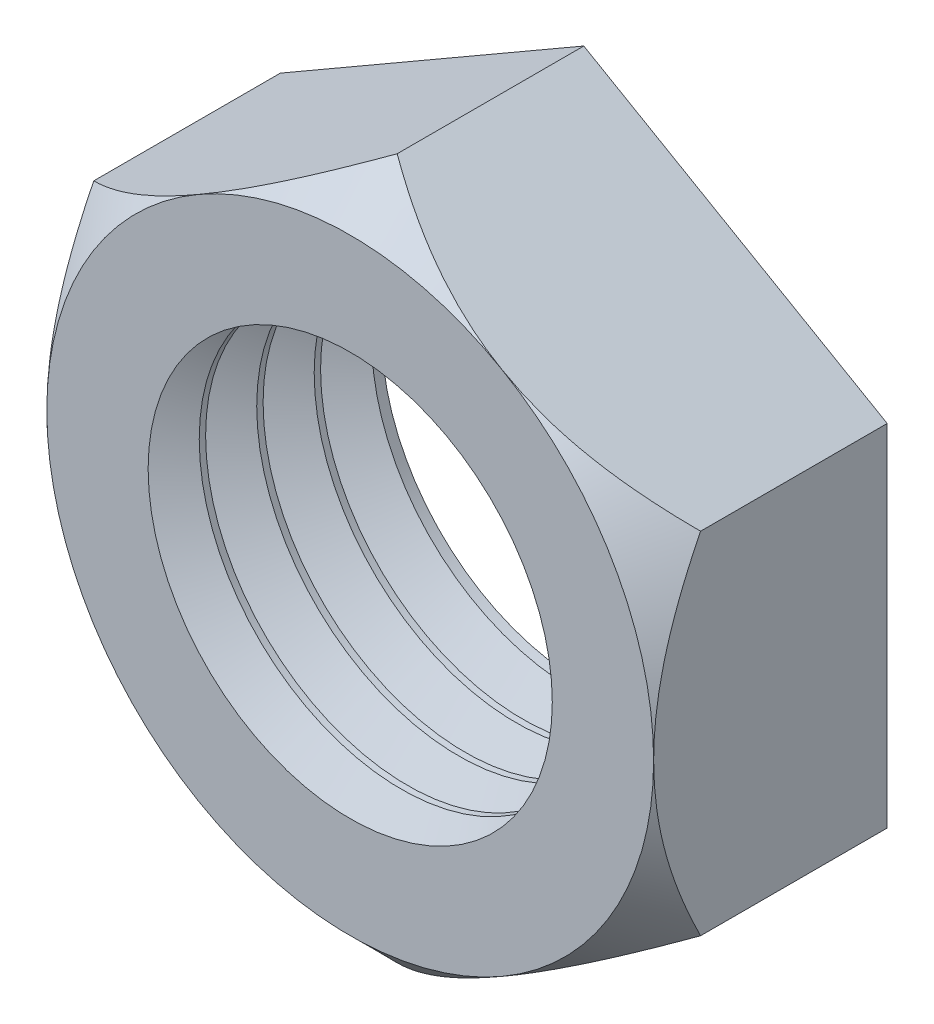
ISO-10303-21;
HEADER;
FILE_DESCRIPTION(('STEP AP214'),'2;1');
FILE_NAME('part.step','',(''),(''),'','','');
FILE_SCHEMA(('AUTOMOTIVE_DESIGN { 1 0 10303 214 1 1 1 1 }'));
ENDSEC;
DATA;
#1=APPLICATION_CONTEXT('core data for automotive mechanical design processes');
#2=APPLICATION_PROTOCOL_DEFINITION('international standard','automotive_design',2000,#1);
#3=PRODUCT_CONTEXT('',#1,'mechanical');
#4=PRODUCT('Part','Part','',(#3));
#5=PRODUCT_RELATED_PRODUCT_CATEGORY('part','',(#4));
#6=PRODUCT_DEFINITION_FORMATION('','',#4);
#7=PRODUCT_DEFINITION_CONTEXT('part definition',#1,'design');
#8=PRODUCT_DEFINITION('design','',#6,#7);
#9=PRODUCT_DEFINITION_SHAPE('','',#8);
#10=(LENGTH_UNIT() NAMED_UNIT(*) SI_UNIT(.MILLI.,.METRE.));
#11=(NAMED_UNIT(*) PLANE_ANGLE_UNIT() SI_UNIT($,.RADIAN.));
#12=(NAMED_UNIT(*) SI_UNIT($,.STERADIAN.) SOLID_ANGLE_UNIT());
#13=UNCERTAINTY_MEASURE_WITH_UNIT(LENGTH_MEASURE(1.E-05),#10,'distance_accuracy_value','');
#14=(GEOMETRIC_REPRESENTATION_CONTEXT(3) GLOBAL_UNCERTAINTY_ASSIGNED_CONTEXT((#13)) GLOBAL_UNIT_ASSIGNED_CONTEXT((#10,
#11,#12)) REPRESENTATION_CONTEXT('',''));
#15=CARTESIAN_POINT('',(0.,0.,0.));
#16=DIRECTION('',(0.,0.,1.));
#17=DIRECTION('',(1.,0.,0.));
#18=AXIS2_PLACEMENT_3D('',#15,#16,#17);
#19=CARTESIAN_POINT('',(0.,0.,1.15624997109326));
#20=DIRECTION('',(0.,0.,1.));
#21=DIRECTION('',(1.,0.,0.));
#22=AXIS2_PLACEMENT_3D('',#19,#20,#21);
#23=CONICAL_SURFACE('',#22,8.4370444529582,1.04719755);
#24=CARTESIAN_POINT('',(0.,0.,1.15624997245338));
#25=DIRECTION('',(0.,0.,-1.));
#26=DIRECTION('',(-1.,0.,0.));
#27=AXIS2_PLACEMENT_3D('',#24,#25,#26);
#28=CIRCLE('',#27,8.43704445374347);
#29=CARTESIAN_POINT('',(-8.43704445374347,0.,1.15624997245338));
#30=VERTEX_POINT('',#29);
#31=EDGE_CURVE('E274',#30,#30,#28,.F.);
#32=ORIENTED_EDGE('',*,*,#31,.T.);
#33=EDGE_LOOP('',(#32));
#34=FACE_BOUND('',#33,.T.);
#35=CARTESIAN_POINT('',(0.,0.,0.281249971999998));
#36=DIRECTION('',(0.,0.,-1.));
#37=DIRECTION('',(-1.,0.,0.));
#38=AXIS2_PLACEMENT_3D('',#35,#36,#37);
#39=CIRCLE('',#38,6.9215);
#40=CARTESIAN_POINT('',(-6.9215,0.,0.281249971999998));
#41=VERTEX_POINT('',#40);
#42=EDGE_CURVE('E271',#41,#41,#39,.T.);
#43=ORIENTED_EDGE('',*,*,#42,.T.);
#44=EDGE_LOOP('',(#43));
#45=FACE_BOUND('',#44,.T.);
#46=ADVANCED_FACE('F16',(#34,#45),#23,.F.);
#47=CARTESIAN_POINT('',(0.,0.,0.281249971999998));
#48=DIRECTION('',(0.,0.,-1.));
#49=DIRECTION('',(-1.,0.,0.));
#50=AXIS2_PLACEMENT_3D('',#47,#48,#49);
#51=CYLINDRICAL_SURFACE('',#50,6.9215);
#52=CARTESIAN_POINT('',(0.,0.,0.0624999729067566));
#53=DIRECTION('',(0.,0.,-1.));
#54=DIRECTION('',(-1.,0.,0.));
#55=AXIS2_PLACEMENT_3D('',#52,#53,#54);
#56=CIRCLE('',#55,6.92150000052351);
#57=CARTESIAN_POINT('',(-6.92150000052351,0.,0.062499972906757));
#58=VERTEX_POINT('',#57);
#59=EDGE_CURVE('E277',#58,#58,#56,.T.);
#60=ORIENTED_EDGE('',*,*,#59,.T.);
#61=EDGE_LOOP('',(#60));
#62=FACE_BOUND('',#61,.T.);
#63=ORIENTED_EDGE('',*,*,#42,.F.);
#64=EDGE_LOOP('',(#63));
#65=FACE_BOUND('',#64,.T.);
#66=ADVANCED_FACE('F531',(#62,#65),#51,.F.);
#67=CARTESIAN_POINT('',(0.,0.,1.15624997245338));
#68=DIRECTION('',(0.,0.,-1.));
#69=DIRECTION('',(-1.,0.,0.));
#70=AXIS2_PLACEMENT_3D('',#67,#68,#69);
#71=CONICAL_SURFACE('',#70,8.43704445374347,1.04719755);
#72=ORIENTED_EDGE('',*,*,#31,.F.);
#73=EDGE_LOOP('',(#72));
#74=FACE_BOUND('',#73,.T.);
#75=CARTESIAN_POINT('',(0.,0.,2.03124997200001));
#76=DIRECTION('',(0.,0.,-1.));
#77=DIRECTION('',(-1.,0.,0.));
#78=AXIS2_PLACEMENT_3D('',#75,#76,#77);
#79=CIRCLE('',#78,6.9215);
#80=CARTESIAN_POINT('',(-6.9215,0.,2.03124997200001));
#81=VERTEX_POINT('',#80);
#82=EDGE_CURVE('E280',#81,#81,#79,.F.);
#83=ORIENTED_EDGE('',*,*,#82,.T.);
#84=EDGE_LOOP('',(#83));
#85=FACE_BOUND('',#84,.T.);
#86=ADVANCED_FACE('F522',(#74,#85),#71,.F.);
#87=CARTESIAN_POINT('',(0.,0.,-0.81250002845337));
#88=DIRECTION('',(0.,0.,-1.));
#89=DIRECTION('',(0.,1.,0.));
#90=AXIS2_PLACEMENT_3D('',#87,#88,#89);
#91=CONICAL_SURFACE('',#90,8.437044455314,1.04719755);
#92=CARTESIAN_POINT('',(0.,0.,-0.81250002845337));
#93=DIRECTION('',(0.,0.,1.));
#94=DIRECTION('',(0.,-1.,0.));
#95=AXIS2_PLACEMENT_3D('',#92,#93,#94);
#96=CIRCLE('',#95,8.43704445374347);
#97=CARTESIAN_POINT('',(0.,-8.43704445374347,-0.81250002845337));
#98=VERTEX_POINT('',#97);
#99=EDGE_CURVE('E283',#98,#98,#96,.F.);
#100=ORIENTED_EDGE('',*,*,#99,.T.);
#101=EDGE_LOOP('',(#100));
#102=FACE_BOUND('',#101,.T.);
#103=ORIENTED_EDGE('',*,*,#59,.F.);
#104=EDGE_LOOP('',(#103));
#105=FACE_BOUND('',#104,.T.);
#106=ADVANCED_FACE('F513',(#102,#105),#91,.F.);
#107=CARTESIAN_POINT('',(0.,0.,2.249999972));
#108=DIRECTION('',(0.,0.,-1.));
#109=DIRECTION('',(-1.,0.,0.));
#110=AXIS2_PLACEMENT_3D('',#107,#108,#109);
#111=CYLINDRICAL_SURFACE('',#110,6.9215);
#112=ORIENTED_EDGE('',*,*,#82,.F.);
#113=EDGE_LOOP('',(#112));
#114=FACE_BOUND('',#113,.T.);
#115=CARTESIAN_POINT('',(0.,0.,2.24999997109325));
#116=DIRECTION('',(0.,0.,1.));
#117=DIRECTION('',(1.,0.,0.));
#118=AXIS2_PLACEMENT_3D('',#115,#116,#117);
#119=CIRCLE('',#118,6.92150000052351);
#120=CARTESIAN_POINT('',(6.92150000052351,0.,2.24999997109325));
#121=VERTEX_POINT('',#120);
#122=EDGE_CURVE('E286',#121,#121,#119,.T.);
#123=ORIENTED_EDGE('',*,*,#122,.T.);
#124=EDGE_LOOP('',(#123));
#125=FACE_BOUND('',#124,.T.);
#126=ADVANCED_FACE('F504',(#114,#125),#111,.F.);
#127=CARTESIAN_POINT('',(0.,0.,-0.812500027093248));
#128=DIRECTION('',(0.,0.,1.));
#129=DIRECTION('',(1.,0.,0.));
#130=AXIS2_PLACEMENT_3D('',#127,#128,#129);
#131=CONICAL_SURFACE('',#130,8.43704445609927,1.04719755);
#132=CARTESIAN_POINT('',(0.,0.,-1.687500028));
#133=DIRECTION('',(0.,0.,-1.));
#134=DIRECTION('',(-1.,0.,0.));
#135=AXIS2_PLACEMENT_3D('',#132,#133,#134);
#136=CIRCLE('',#135,6.9215);
#137=CARTESIAN_POINT('',(-6.9215,0.,-1.687500028));
#138=VERTEX_POINT('',#137);
#139=EDGE_CURVE('E289',#138,#138,#136,.T.);
#140=ORIENTED_EDGE('',*,*,#139,.T.);
#141=EDGE_LOOP('',(#140));
#142=FACE_BOUND('',#141,.T.);
#143=ORIENTED_EDGE('',*,*,#99,.F.);
#144=EDGE_LOOP('',(#143));
#145=FACE_BOUND('',#144,.T.);
#146=ADVANCED_FACE('F495',(#142,#145),#131,.F.);
#147=CARTESIAN_POINT('',(0.,0.,3.12499997109325));
#148=DIRECTION('',(0.,0.,1.));
#149=DIRECTION('',(0.,-1.,0.));
#150=AXIS2_PLACEMENT_3D('',#147,#148,#149);
#151=CONICAL_SURFACE('',#150,8.4370444529582,1.04719755);
#152=CARTESIAN_POINT('',(0.,0.,3.12499997245338));
#153=DIRECTION('',(0.,0.,-1.));
#154=DIRECTION('',(-1.,0.,0.));
#155=AXIS2_PLACEMENT_3D('',#152,#153,#154);
#156=CIRCLE('',#155,8.43704445374347);
#157=CARTESIAN_POINT('',(-8.43704445374347,0.,3.12499997245338));
#158=VERTEX_POINT('',#157);
#159=EDGE_CURVE('E292',#158,#158,#156,.F.);
#160=ORIENTED_EDGE('',*,*,#159,.T.);
#161=EDGE_LOOP('',(#160));
#162=FACE_BOUND('',#161,.T.);
#163=ORIENTED_EDGE('',*,*,#122,.F.);
#164=EDGE_LOOP('',(#163));
#165=FACE_BOUND('',#164,.T.);
#166=ADVANCED_FACE('F486',(#162,#165),#151,.F.);
#167=CARTESIAN_POINT('',(0.,0.,-1.687500028));
#168=DIRECTION('',(0.,0.,-1.));
#169=DIRECTION('',(-1.,0.,0.));
#170=AXIS2_PLACEMENT_3D('',#167,#168,#169);
#171=CYLINDRICAL_SURFACE('',#170,6.9215);
#172=CARTESIAN_POINT('',(0.,0.,-1.90625002709324));
#173=DIRECTION('',(0.,0.,-1.));
#174=DIRECTION('',(-1.,0.,0.));
#175=AXIS2_PLACEMENT_3D('',#172,#173,#174);
#176=CIRCLE('',#175,6.92150000052351);
#177=CARTESIAN_POINT('',(-6.92150000052351,0.,-1.90625002709324));
#178=VERTEX_POINT('',#177);
#179=EDGE_CURVE('E295',#178,#178,#176,.T.);
#180=ORIENTED_EDGE('',*,*,#179,.T.);
#181=EDGE_LOOP('',(#180));
#182=FACE_BOUND('',#181,.T.);
#183=ORIENTED_EDGE('',*,*,#139,.F.);
#184=EDGE_LOOP('',(#183));
#185=FACE_BOUND('',#184,.T.);
#186=ADVANCED_FACE('F477',(#182,#185),#171,.F.);
#187=CARTESIAN_POINT('',(0.,0.,3.12499997245338));
#188=DIRECTION('',(0.,0.,-1.));
#189=DIRECTION('',(-1.,0.,0.));
#190=AXIS2_PLACEMENT_3D('',#187,#188,#189);
#191=CONICAL_SURFACE('',#190,8.43704445374347,1.04719755);
#192=ORIENTED_EDGE('',*,*,#159,.F.);
#193=EDGE_LOOP('',(#192));
#194=FACE_BOUND('',#193,.T.);
#195=CARTESIAN_POINT('',(0.,0.,3.99999997990676));
#196=DIRECTION('',(0.,0.,-1.));
#197=DIRECTION('',(-1.,0.,0.));
#198=AXIS2_PLACEMENT_3D('',#195,#196,#197);
#199=CIRCLE('',#198,6.92149998839916);
#200=CARTESIAN_POINT('',(-6.92149998839916,0.,3.99999997990676));
#201=VERTEX_POINT('',#200);
#202=EDGE_CURVE('E19',#201,#201,#199,.T.);
#203=ORIENTED_EDGE('',*,*,#202,.F.);
#204=EDGE_LOOP('',(#203));
#205=FACE_BOUND('',#204,.T.);
#206=ADVANCED_FACE('F468',(#194,#205),#191,.F.);
#207=CARTESIAN_POINT('',(0.,0.,-2.78125002845337));
#208=DIRECTION('',(0.,0.,-1.));
#209=DIRECTION('',(-1.,0.,0.));
#210=AXIS2_PLACEMENT_3D('',#207,#208,#209);
#211=CONICAL_SURFACE('',#210,8.437044455314,1.04719755);
#212=CARTESIAN_POINT('',(0.,0.,-2.78125002845337));
#213=DIRECTION('',(0.,0.,1.));
#214=DIRECTION('',(0.,-1.,0.));
#215=AXIS2_PLACEMENT_3D('',#212,#213,#214);
#216=CIRCLE('',#215,8.43704445374347);
#217=CARTESIAN_POINT('',(0.,-8.43704445374347,-2.78125002845337));
#218=VERTEX_POINT('',#217);
#219=EDGE_CURVE('E99',#218,#218,#216,.F.);
#220=ORIENTED_EDGE('',*,*,#219,.T.);
#221=EDGE_LOOP('',(#220));
#222=FACE_BOUND('',#221,.T.);
#223=ORIENTED_EDGE('',*,*,#179,.F.);
#224=EDGE_LOOP('',(#223));
#225=FACE_BOUND('',#224,.T.);
#226=ADVANCED_FACE('F460',(#222,#225),#211,.F.);
#227=CARTESIAN_POINT('',(0.,0.,4.));
#228=DIRECTION('',(0.,0.,1.));
#229=DIRECTION('',(1.,0.,0.));
#230=AXIS2_PLACEMENT_3D('',#227,#228,#229);
#231=PLANE('',#230);
#232=CARTESIAN_POINT('',(0.,0.,4.00000000108211));
#233=DIRECTION('',(0.,0.,-1.));
#234=DIRECTION('',(-1.,0.,0.));
#235=AXIS2_PLACEMENT_3D('',#232,#233,#234);
#236=CIRCLE('',#235,10.392304845774);
#237=CARTESIAN_POINT('',(-5.1961524227968,-9.0000000001562,4.00000000126247));
#238=VERTEX_POINT('',#237);
#239=CARTESIAN_POINT('',(-10.3923048455936,0.,4.00000000126247));
#240=VERTEX_POINT('',#239);
#241=EDGE_CURVE('E91',#238,#240,#236,.T.);
#242=ORIENTED_EDGE('',*,*,#241,.F.);
#243=CARTESIAN_POINT('',(0.,0.,4.00000000108212));
#244=DIRECTION('',(0.,0.,-1.));
#245=DIRECTION('',(0.,1.,0.));
#246=AXIS2_PLACEMENT_3D('',#243,#244,#245);
#247=CIRCLE('',#246,10.392304845774);
#248=CARTESIAN_POINT('',(5.19615242279682,-9.00000000015618,4.00000000126247));
#249=VERTEX_POINT('',#248);
#250=EDGE_CURVE('E84',#249,#238,#247,.T.);
#251=ORIENTED_EDGE('',*,*,#250,.F.);
#252=CARTESIAN_POINT('',(0.,0.,4.00000000108212));
#253=DIRECTION('',(0.,0.,-1.));
#254=DIRECTION('',(-1.,0.,0.));
#255=AXIS2_PLACEMENT_3D('',#252,#253,#254);
#256=CIRCLE('',#255,10.392304845774);
#257=CARTESIAN_POINT('',(10.3923048455936,0.,4.00000000126247));
#258=VERTEX_POINT('',#257);
#259=EDGE_CURVE('E347',#258,#249,#256,.T.);
#260=ORIENTED_EDGE('',*,*,#259,.F.);
#261=CARTESIAN_POINT('',(0.,0.,4.00000000108211));
#262=DIRECTION('',(0.,0.,-1.));
#263=DIRECTION('',(-1.,0.,0.));
#264=AXIS2_PLACEMENT_3D('',#261,#262,#263);
#265=CIRCLE('',#264,10.392304845774);
#266=CARTESIAN_POINT('',(5.19615242279681,9.0000000001562,4.00000000126246));
#267=VERTEX_POINT('',#266);
#268=EDGE_CURVE('E120',#267,#258,#265,.T.);
#269=ORIENTED_EDGE('',*,*,#268,.F.);
#270=CARTESIAN_POINT('',(0.,0.,4.00000000108211));
#271=DIRECTION('',(0.,0.,-1.));
#272=DIRECTION('',(-1.,0.,0.));
#273=AXIS2_PLACEMENT_3D('',#270,#271,#272);
#274=CIRCLE('',#273,10.392304845774);
#275=CARTESIAN_POINT('',(-5.19615242279681,9.00000000015619,4.00000000126247));
#276=VERTEX_POINT('',#275);
#277=EDGE_CURVE('E115',#276,#267,#274,.T.);
#278=ORIENTED_EDGE('',*,*,#277,.F.);
#279=CARTESIAN_POINT('',(0.,0.,4.00000000108212));
#280=DIRECTION('',(0.,0.,-1.));
#281=DIRECTION('',(-1.,0.,0.));
#282=AXIS2_PLACEMENT_3D('',#279,#280,#281);
#283=CIRCLE('',#282,10.392304845774);
#284=EDGE_CURVE('E111',#240,#276,#283,.T.);
#285=ORIENTED_EDGE('',*,*,#284,.F.);
#286=EDGE_LOOP('',(#242,#251,#260,#269,#278,#285));
#287=FACE_BOUND('',#286,.T.);
#288=ORIENTED_EDGE('',*,*,#202,.T.);
#289=EDGE_LOOP('',(#288));
#290=FACE_BOUND('',#289,.T.);
#291=ADVANCED_FACE('F112',(#287,#290),#231,.T.);
#292=CARTESIAN_POINT('',(0.,0.,-2.78125002709325));
#293=DIRECTION('',(0.,0.,1.));
#294=DIRECTION('',(1.,0.,0.));
#295=AXIS2_PLACEMENT_3D('',#292,#293,#294);
#296=CONICAL_SURFACE('',#295,8.43704445609927,1.04719755);
#297=CARTESIAN_POINT('',(0.,0.,-3.656250028));
#298=DIRECTION('',(0.,0.,-1.));
#299=DIRECTION('',(0.,1.,0.));
#300=AXIS2_PLACEMENT_3D('',#297,#298,#299);
#301=CIRCLE('',#300,6.9215);
#302=CARTESIAN_POINT('',(0.,6.9215,-3.656250028));
#303=VERTEX_POINT('',#302);
#304=EDGE_CURVE('E108',#303,#303,#301,.T.);
#305=ORIENTED_EDGE('',*,*,#304,.T.);
#306=EDGE_LOOP('',(#305));
#307=FACE_BOUND('',#306,.T.);
#308=ORIENTED_EDGE('',*,*,#219,.F.);
#309=EDGE_LOOP('',(#308));
#310=FACE_BOUND('',#309,.T.);
#311=ADVANCED_FACE('F445',(#307,#310),#296,.F.);
#312=CARTESIAN_POINT('',(0.,0.,2.38265867317291));
#313=DIRECTION('',(0.,0.,-1.));
#314=DIRECTION('',(-1.,0.,0.));
#315=AXIS2_PLACEMENT_3D('',#312,#313,#314);
#316=CONICAL_SURFACE('',#315,12.0096461707802,0.785398162500001);
#317=CARTESIAN_POINT('',(-10.3923048453442,-6.00000000004259,2.3923048439113));
#318=CARTESIAN_POINT('',(-10.3923048453885,-5.79237577196853,2.49609872777504));
#319=CARTESIAN_POINT('',(-10.3923048454066,-5.58311473854417,2.59670550880556));
#320=CARTESIAN_POINT('',(-10.3923048454199,-5.16105784999074,2.79052730874488));
#321=CARTESIAN_POINT('',(-10.392304845415,-4.94826003053554,2.88373804186974));
#322=CARTESIAN_POINT('',(-10.3923048454115,-4.51776287452618,3.06218542085323));
#323=CARTESIAN_POINT('',(-10.3923048454128,-4.30004118512207,3.14736846193257));
#324=CARTESIAN_POINT('',(-10.3923048454137,-3.86100296711694,3.3078291979485));
#325=CARTESIAN_POINT('',(-10.3923048454134,-3.63968708510121,3.38310865281508));
#326=CARTESIAN_POINT('',(-10.3923048454131,-3.19996169447216,3.52044170791733));
#327=CARTESIAN_POINT('',(-10.3923048454132,-2.98165222095919,3.58281392682351));
#328=CARTESIAN_POINT('',(-10.3923048454133,-2.54200134469051,3.69573269703281));
#329=CARTESIAN_POINT('',(-10.3923048454133,-2.3206602959414,3.74628061684182));
#330=CARTESIAN_POINT('',(-10.3923048454132,-1.8760054250024,3.83427279503125));
#331=CARTESIAN_POINT('',(-10.3923048454133,-1.65269868083622,3.87175262176335));
#332=CARTESIAN_POINT('',(-10.3923048454133,-1.20423537087386,3.93281722056475));
#333=CARTESIAN_POINT('',(-10.3923048454133,-0.979079419726001,3.95640643409156));
#334=CARTESIAN_POINT('',(-10.3923048454133,-0.62831243828224,3.98177234166128));
#335=CARTESIAN_POINT('',(-10.3923048454133,-0.503048382231533,3.98858481468052));
#336=CARTESIAN_POINT('',(-10.3923048454133,-0.251859881696289,3.99771037885274));
#337=CARTESIAN_POINT('',(-10.3923048454133,-0.125934786749771,4.00000554102079));
#338=CARTESIAN_POINT('',(-10.3923048454133,-4.49236131385679E-13,4.00000000144282));
#339=B_SPLINE_CURVE_WITH_KNOTS('',3,(#317,#318,#319,#320,#321,#322,#323,#324,#325,#326,#327,
#328,#329,#330,#331,#332,#333,#334,#335,#336,#337,#338),.UNSPECIFIED.,.F.,.F.,(4,2,2,2,2,2,2,2,
2,2,4),(0.,0.696398794865031,1.39319822845339,2.09436224008043,2.79540148162587,
3.47623865889172,4.15699699924909,4.83588773640886,5.51456128344909,5.89083555532098,
6.2686002536273),.UNSPECIFIED.);
#340=CARTESIAN_POINT('',(-10.3923048453183,-6.0000000000837,2.39230484401083));
#341=VERTEX_POINT('',#340);
#342=EDGE_CURVE('E94',#341,#240,#339,.T.);
#343=ORIENTED_EDGE('',*,*,#342,.F.);
#344=CARTESIAN_POINT('',(-5.19615242269922,-8.99999999998719,4.00000000143668));
#345=CARTESIAN_POINT('',(-5.33437261822789,-8.92019853290223,4.00001853543615));
#346=CARTESIAN_POINT('',(-5.47258733629963,-8.84040022822204,3.99632376869045));
#347=CARTESIAN_POINT('',(-5.7487051980806,-8.68098350639802,3.98164530028896));
#348=CARTESIAN_POINT('',(-5.88660838737867,-8.60136506293347,3.97066274522179));
#349=CARTESIAN_POINT('',(-6.16160480227687,-8.44259580876492,3.94157182630042));
#350=CARTESIAN_POINT('',(-6.29869902439586,-8.3634444227205,3.92347599718512));
#351=CARTESIAN_POINT('',(-6.57207063131448,-8.20561325187748,3.88041912889507));
#352=CARTESIAN_POINT('',(-6.70834799336217,-8.12693348021472,3.85545789939841));
#353=CARTESIAN_POINT('',(-7.11151499325504,-7.89416490429807,3.77160078725362));
#354=CARTESIAN_POINT('',(-7.37696283436775,-7.7409085217759,3.70326481991403));
#355=CARTESIAN_POINT('',(-7.90277070584381,-7.43733320563722,3.54418445449536));
#356=CARTESIAN_POINT('',(-8.16312911515125,-7.28701520793777,3.45343303835164));
#357=CARTESIAN_POINT('',(-8.58894342522974,-7.04117120138915,3.28759570203875));
#358=CARTESIAN_POINT('',(-8.75602321720226,-6.94470763851767,3.21797784442287));
#359=CARTESIAN_POINT('',(-9.08773382943286,-6.75319442725328,3.07147266619887));
#360=CARTESIAN_POINT('',(-9.25236515778529,-6.65814448551196,2.99458687886423));
#361=CARTESIAN_POINT('',(-9.58093232475545,-6.46844614321487,2.83353196449532));
#362=CARTESIAN_POINT('',(-9.7448433694236,-6.37381205745256,2.7492957467294));
#363=CARTESIAN_POINT('',(-10.0703125777773,-6.18590232239659,2.5749893388567));
#364=CARTESIAN_POINT('',(-10.2318708972882,-6.09262658313715,2.48491953729112));
#365=CARTESIAN_POINT('',(-10.3923048452233,-6.00000000010967,2.39230484408009));
#366=B_SPLINE_CURVE_WITH_KNOTS('',3,(#344,#345,#346,#347,#348,#349,#350,#351,#352,#353,#354,
#355,#356,#357,#358,#359,#360,#361,#362,#363,#364,#365),.UNSPECIFIED.,.F.,.F.,(4,2,2,2,2,2,2,2,
2,2,4),(0.,0.478755558893586,0.957435812969677,1.43527630939038,1.91313005378942,
2.85418855130895,3.79554205963596,4.41070984604211,5.025748142432,5.64714607408035,
6.268502660491),.UNSPECIFIED.);
#367=EDGE_CURVE('E96',#238,#341,#366,.T.);
#368=ORIENTED_EDGE('',*,*,#367,.F.);
#369=ORIENTED_EDGE('',*,*,#241,.T.);
#370=EDGE_LOOP('',(#343,#368,#369));
#371=FACE_BOUND('',#370,.T.);
#372=ADVANCED_FACE('F93',(#371),#316,.T.);
#373=CARTESIAN_POINT('',(0.,0.,2.38265867331806));
#374=DIRECTION('',(0.,0.,-1.));
#375=DIRECTION('',(0.,1.,0.));
#376=AXIS2_PLACEMENT_3D('',#373,#374,#375);
#377=CONICAL_SURFACE('',#376,12.0096461706351,0.7853981625);
#378=CARTESIAN_POINT('',(-1.06763925418976E-10,-11.9999999999264,2.39230484402939));
#379=CARTESIAN_POINT('',(-0.179807856066108,-11.8961878858935,2.49609872787171));
#380=CARTESIAN_POINT('',(-0.361033227033801,-11.7915573691845,2.59670550889067));
#381=CARTESIAN_POINT('',(-0.726545214357981,-11.5805289249131,2.79052730881572));
#382=CARTESIAN_POINT('',(-0.910833531870799,-11.4741300151878,2.88373804193786));
#383=CARTESIAN_POINT('',(-1.28365500522259,-11.2588814371878,3.06218542091381));
#384=CARTESIAN_POINT('',(-1.47220751919745,-11.1500205924883,3.1473684619883));
#385=CARTESIAN_POINT('',(-1.85242576921362,-10.9305014834908,3.30782919799539));
#386=CARTESIAN_POINT('',(-2.04409094529563,-10.8198435424855,3.38310865285798));
#387=CARTESIAN_POINT('',(-2.42490430426077,-10.5999808471759,3.5204417079527));
#388=CARTESIAN_POINT('',(-2.61396585420574,-10.4908261104218,3.58281392685531));
#389=CARTESIAN_POINT('',(-2.99471468184217,-10.2710006722923,3.69573269705787));
#390=CARTESIAN_POINT('',(-3.18640165295492,-10.1603301479202,3.74628061686372));
#391=CARTESIAN_POINT('',(-3.57148406709587,-9.93800271245575,3.83427279504731));
#392=CARTESIAN_POINT('',(-3.76487338037571,-9.82634934037523,3.87175262177671));
#393=CARTESIAN_POINT('',(-4.1532539994593,-9.60211768539929,3.9328172205733));
#394=CARTESIAN_POINT('',(-4.34824477296197,-9.48953970982803,3.956406434098));
#395=CARTESIAN_POINT('',(-4.65201788968715,-9.31415621911418,3.9817723416644));
#396=CARTESIAN_POINT('',(-4.76049974439888,-9.25152419109417,3.98858481468247));
#397=CARTESIAN_POINT('',(-4.97803536698228,-9.12592994083731,3.99771037885313));
#398=CARTESIAN_POINT('',(-5.08708969817054,-9.06296739336947,4.00000554102078));
#399=CARTESIAN_POINT('',(-5.19615242270624,-9.00000000000023,4.00000000144281));
#400=B_SPLINE_CURVE_WITH_KNOTS('',3,(#378,#379,#380,#381,#382,#383,#384,#385,#386,#387,#388,
#389,#390,#391,#392,#393,#394,#395,#396,#397,#398,#399),.UNSPECIFIED.,.F.,.F.,(4,2,2,2,2,2,2,2,
2,2,4),(0.,0.696398794845799,1.3931982284154,2.09436224002394,2.79540148155069,3.47623865880001,
4.15699699914089,4.83588773628413,5.5145612833078,5.89083555514751,6.2686002534213),.UNSPECIFIED.);
#401=CARTESIAN_POINT('',(1.49877807747496E-11,-11.9999999999279,2.39230484404258));
#402=VERTEX_POINT('',#401);
#403=EDGE_CURVE('E124',#402,#238,#400,.T.);
#404=ORIENTED_EDGE('',*,*,#403,.F.);
#405=CARTESIAN_POINT('',(5.19615242269924,-8.99999999998717,4.00000000143669));
#406=CARTESIAN_POINT('',(5.05793222718005,-9.07980146708857,4.00001853543616));
#407=CARTESIAN_POINT('',(4.9197175091122,-9.15959977177551,3.99632376869046));
#408=CARTESIAN_POINT('',(4.64359964733408,-9.31901649360446,3.98164530028897));
#409=CARTESIAN_POINT('',(4.50569645803495,-9.39863493706722,3.97066274522181));
#410=CARTESIAN_POINT('',(4.23070004313598,-9.55740419123444,3.94157182630043));
#411=CARTESIAN_POINT('',(4.09360582101726,-9.63655557727934,3.92347599718513));
#412=CARTESIAN_POINT('',(3.82023421409885,-9.79438674812273,3.88041912889507));
#413=CARTESIAN_POINT('',(3.68395685205109,-9.87306651978538,3.85545789939841));
#414=CARTESIAN_POINT('',(3.28078985215812,-10.1058350957018,3.77160078725362));
#415=CARTESIAN_POINT('',(3.01534201104546,-10.2590914782241,3.70326481991404));
#416=CARTESIAN_POINT('',(2.48953413956947,-10.5626667943628,3.54418445449537));
#417=CARTESIAN_POINT('',(2.22917573026202,-10.7129847920622,3.45343303835165));
#418=CARTESIAN_POINT('',(1.80336142017916,-10.9588287986134,3.28759570203706));
#419=CARTESIAN_POINT('',(1.63628162820233,-11.0552923614873,3.21797784441927));
#420=CARTESIAN_POINT('',(1.30457101596323,-11.2468055727566,3.07147266619108));
#421=CARTESIAN_POINT('',(1.13993968760661,-11.3418555145004,2.99458687885417));
#422=CARTESIAN_POINT('',(0.811372520628102,-11.5315538568023,2.83353196448037));
#423=CARTESIAN_POINT('',(0.647461475955789,-11.626187942567,2.74929574671182));
#424=CARTESIAN_POINT('',(0.321992267593839,-11.8140976776277,2.57498933883362));
#425=CARTESIAN_POINT('',(0.160433948078911,-11.9073734168895,2.48491953726517));
#426=CARTESIAN_POINT('',(1.39824451651399E-10,-11.9999999999193,2.39230484405117));
#427=B_SPLINE_CURVE_WITH_KNOTS('',3,(#405,#406,#407,#408,#409,#410,#411,#412,#413,#414,#415,
#416,#417,#418,#419,#420,#421,#422,#423,#424,#425,#426),.UNSPECIFIED.,.F.,.F.,(4,2,2,2,2,2,2,2,
2,2,4),(0.,0.478755558893602,0.957435812969709,1.43527630939043,1.91313005378948,
2.85418855130897,3.79554205963595,4.41070984605809,5.02574814246398,5.64714607412869,
6.26850266055568),.UNSPECIFIED.);
#428=EDGE_CURVE('E229',#249,#402,#427,.T.);
#429=ORIENTED_EDGE('',*,*,#428,.F.);
#430=ORIENTED_EDGE('',*,*,#250,.T.);
#431=EDGE_LOOP('',(#404,#429,#430));
#432=FACE_BOUND('',#431,.T.);
#433=ADVANCED_FACE('F218',(#432),#377,.T.);
#434=CARTESIAN_POINT('',(0.,0.,2.38265867331806));
#435=DIRECTION('',(0.,0.,-1.));
#436=DIRECTION('',(-1.,0.,0.));
#437=AXIS2_PLACEMENT_3D('',#434,#435,#436);
#438=CONICAL_SURFACE('',#437,12.0096461706351,0.7853981625);
#439=ORIENTED_EDGE('',*,*,#259,.T.);
#440=CARTESIAN_POINT('',(10.3923048452962,-6.00000000005568,2.3923048440294));
#441=CARTESIAN_POINT('',(10.2124969893434,-6.10381211410003,2.49609872787172));
#442=CARTESIAN_POINT('',(10.0312716183785,-6.20844263081379,2.59670550889068));
#443=CARTESIAN_POINT('',(9.66575963105628,-6.41947107508859,2.79052730881572));
#444=CARTESIAN_POINT('',(9.48147131354273,-6.5258699848127,2.88373804193787));
#445=CARTESIAN_POINT('',(9.10864984019041,-6.74111856281171,3.06218542091382));
#446=CARTESIAN_POINT('',(8.92009732621574,-6.8499794075116,3.14736846198831));
#447=CARTESIAN_POINT('',(8.53987907619972,-7.06949851650932,3.3078291979954));
#448=CARTESIAN_POINT('',(8.34821390011765,-7.18015645751452,3.38310865285798));
#449=CARTESIAN_POINT('',(7.96740054115247,-7.40001915282403,3.52044170795271));
#450=CARTESIAN_POINT('',(7.77833899120752,-7.50917388957817,3.58281392685531));
#451=CARTESIAN_POINT('',(7.3975901635711,-7.7289993277077,3.69573269705788));
#452=CARTESIAN_POINT('',(7.20590319245834,-7.83966985207979,3.74628061686373));
#453=CARTESIAN_POINT('',(6.82082077831739,-8.06199728754426,3.83427279504731));
#454=CARTESIAN_POINT('',(6.62743146503755,-8.17365065962477,3.87175262177671));
#455=CARTESIAN_POINT('',(6.23905084595396,-8.39788231460072,3.93281722057331));
#456=CARTESIAN_POINT('',(6.04406007245129,-8.51046029017198,3.95640643409801));
#457=CARTESIAN_POINT('',(5.74028695572611,-8.68584378088583,3.98177234166441));
#458=CARTESIAN_POINT('',(5.63180510101438,-8.74847580890584,3.98858481468247));
#459=CARTESIAN_POINT('',(5.41426947843099,-8.8740700591627,3.99771037885313));
#460=CARTESIAN_POINT('',(5.30521514724272,-8.93703260663053,4.00000554102079));
#461=CARTESIAN_POINT('',(5.19615242270702,-8.99999999999977,4.00000000144282));
#462=B_SPLINE_CURVE_WITH_KNOTS('',3,(#440,#441,#442,#443,#444,#445,#446,#447,#448,#449,#450,
#451,#452,#453,#454,#455,#456,#457,#458,#459,#460,#461),.UNSPECIFIED.,.F.,.F.,(4,2,2,2,2,2,2,2,
2,2,4),(0.,0.696398794845801,1.3931982284154,2.09436224002394,2.79540148155069,3.47623865880002,
4.15699699914089,4.83588773628413,5.5145612833078,5.89083555514751,6.2686002534213),.UNSPECIFIED.);
#463=CARTESIAN_POINT('',(10.3923048453583,-5.99999999995095,2.39230484404258));
#464=VERTEX_POINT('',#463);
#465=EDGE_CURVE('E223',#464,#249,#462,.T.);
#466=ORIENTED_EDGE('',*,*,#465,.F.);
#467=CARTESIAN_POINT('',(10.3923048453985,0.,4.00000000143669));
#468=CARTESIAN_POINT('',(10.3923048454079,-0.159602934186367,4.00001853543616));
#469=CARTESIAN_POINT('',(10.3923048454118,-0.319199543553494,3.99632376869046));
#470=CARTESIAN_POINT('',(10.3923048454147,-0.638032987206474,3.98164530028897));
#471=CARTESIAN_POINT('',(10.3923048454136,-0.797269874133782,3.97066274522181));
#472=CARTESIAN_POINT('',(10.3923048454129,-1.11480838246955,3.94157182630043));
#473=CARTESIAN_POINT('',(10.3923048454132,-1.27311115455888,3.92347599718513));
#474=CARTESIAN_POINT('',(10.3923048454134,-1.5887734962453,3.88041912889507));
#475=CARTESIAN_POINT('',(10.3923048454133,-1.74613303957071,3.85545789939842));
#476=CARTESIAN_POINT('',(10.3923048454132,-2.21167019140381,3.77160078725362));
#477=CARTESIAN_POINT('',(10.3923048454132,-2.51818295644823,3.70326481991403));
#478=CARTESIAN_POINT('',(10.3923048454133,-3.12533358872563,3.54418445449537));
#479=CARTESIAN_POINT('',(10.3923048454133,-3.4259695841245,3.45343303835165));
#480=CARTESIAN_POINT('',(10.3923048454133,-3.91765759722676,3.28759570203706));
#481=CARTESIAN_POINT('',(10.3923048454133,-4.1105847229747,3.21797784441926));
#482=CARTESIAN_POINT('',(10.3923048454133,-4.4936111455133,3.07147266619107));
#483=CARTESIAN_POINT('',(10.3923048454133,-4.68371102900078,2.99458687885417));
#484=CARTESIAN_POINT('',(10.3923048454133,-5.06310771360461,2.83353196448037));
#485=CARTESIAN_POINT('',(10.3923048454133,-5.25237588513403,2.74929574671182));
#486=CARTESIAN_POINT('',(10.3923048454133,-5.62819535525544,2.57498933883362));
#487=CARTESIAN_POINT('',(10.3923048454133,-5.81474683377897,2.48491953726517));
#488=CARTESIAN_POINT('',(10.3923048454133,-5.99999999983854,2.39230484405117));
#489=B_SPLINE_CURVE_WITH_KNOTS('',3,(#467,#468,#469,#470,#471,#472,#473,#474,#475,#476,#477,
#478,#479,#480,#481,#482,#483,#484,#485,#486,#487,#488),.UNSPECIFIED.,.F.,.F.,(4,2,2,2,2,2,2,2,
2,2,4),(0.,0.478755558893604,0.957435812969712,1.43527630939043,1.91313005378948,
2.85418855130897,3.79554205963596,4.41070984605809,5.02574814246398,5.64714607412868,
6.26850266055567),.UNSPECIFIED.);
#490=EDGE_CURVE('E203',#258,#464,#489,.T.);
#491=ORIENTED_EDGE('',*,*,#490,.F.);
#492=EDGE_LOOP('',(#439,#466,#491));
#493=FACE_BOUND('',#492,.T.);
#494=ADVANCED_FACE('F215',(#493),#438,.T.);
#495=CARTESIAN_POINT('',(0.,0.,2.38265867331806));
#496=DIRECTION('',(0.,0.,-1.));
#497=DIRECTION('',(-1.,0.,0.));
#498=AXIS2_PLACEMENT_3D('',#495,#496,#497);
#499=CONICAL_SURFACE('',#498,12.0096461706351,0.7853981625);
#500=ORIENTED_EDGE('',*,*,#268,.T.);
#501=CARTESIAN_POINT('',(10.3923048454029,5.99999999987078,2.3923048440294));
#502=CARTESIAN_POINT('',(10.3923048454096,5.79237577179352,2.49609872787172));
#503=CARTESIAN_POINT('',(10.3923048454123,5.58311473837072,2.59670550889068));
#504=CARTESIAN_POINT('',(10.3923048454143,5.16105784982456,2.79052730881572));
#505=CARTESIAN_POINT('',(10.3923048454135,4.94826003037509,2.88373804193787));
#506=CARTESIAN_POINT('',(10.392304845413,4.51776287437612,3.06218542091381));
#507=CARTESIAN_POINT('',(10.3923048454132,4.3000411849767,3.14736846198831));
#508=CARTESIAN_POINT('',(10.3923048454133,3.86100296698149,3.3078291979954));
#509=CARTESIAN_POINT('',(10.3923048454133,3.639687084971,3.38310865285798));
#510=CARTESIAN_POINT('',(10.3923048454132,3.19996169435192,3.52044170795271));
#511=CARTESIAN_POINT('',(10.3923048454133,2.98165222084365,3.58281392685532));
#512=CARTESIAN_POINT('',(10.3923048454133,2.54200134458461,3.69573269705788));
#513=CARTESIAN_POINT('',(10.3923048454133,2.32066029584042,3.74628061686373));
#514=CARTESIAN_POINT('',(10.3923048454133,1.87600542491149,3.83427279504732));
#515=CARTESIAN_POINT('',(10.3923048454133,1.65269868075046,3.87175262177672));
#516=CARTESIAN_POINT('',(10.3923048454133,1.20423537079857,3.93281722057331));
#517=CARTESIAN_POINT('',(10.3923048454133,0.979079419656048,3.95640643409801));
#518=CARTESIAN_POINT('',(10.3923048454133,0.628312438228342,3.98177234166441));
#519=CARTESIAN_POINT('',(10.3923048454133,0.503048382188321,3.98858481468248));
#520=CARTESIAN_POINT('',(10.3923048454133,0.251859881674603,3.99771037885314));
#521=CARTESIAN_POINT('',(10.3923048454133,0.125934786738925,4.00000554102079));
#522=CARTESIAN_POINT('',(10.3923048454133,4.44944776005441E-13,4.00000000144283));
#523=B_SPLINE_CURVE_WITH_KNOTS('',3,(#501,#502,#503,#504,#505,#506,#507,#508,#509,#510,#511,
#512,#513,#514,#515,#516,#517,#518,#519,#520,#521,#522),.UNSPECIFIED.,.F.,.F.,(4,2,2,2,2,2,2,2,
2,2,4),(0.,0.6963987948458,1.3931982284154,2.09436224002394,2.7954014815507,3.47623865880003,
4.1569969991409,4.83588773628414,5.51456128330781,5.89083555514753,6.26860025342133),.UNSPECIFIED.);
#524=CARTESIAN_POINT('',(10.3923048453433,5.99999999997693,2.39230484404257));
#525=VERTEX_POINT('',#524);
#526=EDGE_CURVE('E209',#525,#258,#523,.T.);
#527=ORIENTED_EDGE('',*,*,#526,.F.);
#528=CARTESIAN_POINT('',(5.19615242269923,8.99999999998718,4.00000000143668));
#529=CARTESIAN_POINT('',(5.33437261822791,8.92019853290222,4.00001853543615));
#530=CARTESIAN_POINT('',(5.47258733629965,8.84040022822203,3.99632376869045));
#531=CARTESIAN_POINT('',(5.74870519808063,8.680983506398,3.98164530028896));
#532=CARTESIAN_POINT('',(5.8866083873787,8.60136506293345,3.97066274522179));
#533=CARTESIAN_POINT('',(6.16160480227692,8.4425958087649,3.94157182630042));
#534=CARTESIAN_POINT('',(6.29869902439591,8.36344442272048,3.92347599718512));
#535=CARTESIAN_POINT('',(6.57207063131453,8.20561325187745,3.88041912889506));
#536=CARTESIAN_POINT('',(6.70834799336223,8.12693348021468,3.8554578993984));
#537=CARTESIAN_POINT('',(7.11151499325509,7.89416490429804,3.7716007872536));
#538=CARTESIAN_POINT('',(7.3769628343678,7.74090852177588,3.70326481991402));
#539=CARTESIAN_POINT('',(7.90277070584383,7.43733320563721,3.54418445449536));
#540=CARTESIAN_POINT('',(8.16312911515126,7.28701520793776,3.45343303835164));
#541=CARTESIAN_POINT('',(8.58894342523412,7.04117120138662,3.28759570203704));
#542=CARTESIAN_POINT('',(8.75602321721095,6.94470763851265,3.21797784441925));
#543=CARTESIAN_POINT('',(9.08773382945004,6.75319442724336,3.07147266619106));
#544=CARTESIAN_POINT('',(9.25236515780666,6.65814448549962,2.99458687885415));
#545=CARTESIAN_POINT('',(9.58093232478516,6.46844614319771,2.83353196448036));
#546=CARTESIAN_POINT('',(9.74484336945747,6.373812057433,2.74929574671181));
#547=CARTESIAN_POINT('',(10.0703125778194,6.1859023223723,2.57498933883361));
#548=CARTESIAN_POINT('',(10.2318708973343,6.09262658311053,2.48491953726517));
#549=CARTESIAN_POINT('',(10.3923048452734,6.00000000008074,2.39230484405116));
#550=B_SPLINE_CURVE_WITH_KNOTS('',3,(#528,#529,#530,#531,#532,#533,#534,#535,#536,#537,#538,
#539,#540,#541,#542,#543,#544,#545,#546,#547,#548,#549),.UNSPECIFIED.,.F.,.F.,(4,2,2,2,2,2,2,2,
2,2,4),(0.,0.478755558893604,0.957435812969711,1.43527630939043,1.91313005378948,
2.85418855130897,3.79554205963596,4.41070984605809,5.02574814246397,5.64714607412867,
6.26850266055566),.UNSPECIFIED.);
#551=EDGE_CURVE('E173',#267,#525,#550,.T.);
#552=ORIENTED_EDGE('',*,*,#551,.F.);
#553=EDGE_LOOP('',(#500,#527,#552));
#554=FACE_BOUND('',#553,.T.);
#555=ADVANCED_FACE('F153',(#554),#499,.T.);
#556=CARTESIAN_POINT('',(0.,0.,2.38265867331807));
#557=DIRECTION('',(0.,0.,-1.));
#558=DIRECTION('',(-1.,0.,0.));
#559=AXIS2_PLACEMENT_3D('',#556,#557,#558);
#560=CONICAL_SURFACE('',#559,12.0096461706351,0.7853981625);
#561=CARTESIAN_POINT('',(-10.3923048452748,6.00000000008243,2.3923048440522));
#562=CARTESIAN_POINT('',(-10.2124969893174,6.10381211412026,2.49609872789009));
#563=CARTESIAN_POINT('',(-10.0312716183509,6.20844263083108,2.59670550890672));
#564=CARTESIAN_POINT('',(-9.6657596310286,6.41947107510316,2.79052730882898));
#565=CARTESIAN_POINT('',(-9.48147131351642,6.5258699848275,2.88373804195067));
#566=CARTESIAN_POINT('',(-9.10864984016608,6.74111856282613,3.06218542092526));
#567=CARTESIAN_POINT('',(-8.92009732619202,6.84997940752539,3.14736846199884));
#568=CARTESIAN_POINT('',(-8.53987907617745,7.06949851652207,3.30782919800428));
#569=CARTESIAN_POINT('',(-8.34821390009625,7.18015645752684,3.38310865286613));
#570=CARTESIAN_POINT('',(-7.96740054113265,7.40001915283549,3.52044170795945));
#571=CARTESIAN_POINT('',(-7.77833899118841,7.5091738895892,3.58281392686139));
#572=CARTESIAN_POINT('',(-7.39759016355349,7.72899932771786,3.6957326970627));
#573=CARTESIAN_POINT('',(-7.2059031924415,7.83966985208951,3.74628061686795));
#574=CARTESIAN_POINT('',(-6.82082077830212,8.06199728755307,3.83427279505043));
#575=CARTESIAN_POINT('',(-6.62743146502308,8.17365065963312,3.87175262177932));
#576=CARTESIAN_POINT('',(-6.23905084594113,8.39788231460812,3.93281722057499));
#577=CARTESIAN_POINT('',(-6.04406007243929,8.5104602901789,3.95640643409929));
#578=CARTESIAN_POINT('',(-5.7402869557168,8.6858437808912,3.98177234166504));
#579=CARTESIAN_POINT('',(-5.63180510100691,8.74847580891015,3.98858481468287));
#580=CARTESIAN_POINT('',(-5.41426947842723,8.87407005916486,3.99771037885322));
#581=CARTESIAN_POINT('',(-5.30521514724084,8.93703260663162,4.00000554102079));
#582=CARTESIAN_POINT('',(-5.19615242270701,8.99999999999978,4.00000000144282));
#583=B_SPLINE_CURVE_WITH_KNOTS('',3,(#561,#562,#563,#564,#565,#566,#567,#568,#569,#570,#571,
#572,#573,#574,#575,#576,#577,#578,#579,#580,#581,#582),.UNSPECIFIED.,.F.,.F.,(4,2,2,2,2,2,2,2,
2,2,4),(0.,0.696398794842266,1.39319822840843,2.09436224001361,2.79540148153695,
3.47623865878329,4.15699699912119,4.83588773626144,5.51456128328211,5.8908355551154,
6.26860025338272),.UNSPECIFIED.);
#584=CARTESIAN_POINT('',(-10.3923048454133,5.9999999999365,2.39230484400218));
#585=VERTEX_POINT('',#584);
#586=EDGE_CURVE('E123',#585,#276,#583,.T.);
#587=ORIENTED_EDGE('',*,*,#586,.F.);
#588=CARTESIAN_POINT('',(-10.3923048453985,0.,4.00000000143669));
#589=CARTESIAN_POINT('',(-10.3923048454079,0.159602934186366,4.00001853543616));
#590=CARTESIAN_POINT('',(-10.3923048454118,0.319199543553496,3.99632376869046));
#591=CARTESIAN_POINT('',(-10.3923048454147,0.638032987206483,3.98164530028897));
#592=CARTESIAN_POINT('',(-10.3923048454136,0.797269874133795,3.97066274522181));
#593=CARTESIAN_POINT('',(-10.3923048454129,1.11480838246957,3.94157182630043));
#594=CARTESIAN_POINT('',(-10.3923048454132,1.2731111545589,3.92347599718513));
#595=CARTESIAN_POINT('',(-10.3923048454134,1.58877349624532,3.88041912889507));
#596=CARTESIAN_POINT('',(-10.3923048454133,1.74613303957074,3.85545789939841));
#597=CARTESIAN_POINT('',(-10.3923048454132,2.21167019140383,3.77160078725361));
#598=CARTESIAN_POINT('',(-10.3923048454132,2.51818295644825,3.70326481991403));
#599=CARTESIAN_POINT('',(-10.3923048454133,3.12533358872563,3.54418445449537));
#600=CARTESIAN_POINT('',(-10.3923048454133,3.4259695841245,3.45343303835165));
#601=CARTESIAN_POINT('',(-10.3923048454133,3.91765759722971,3.28759570203606));
#602=CARTESIAN_POINT('',(-10.3923048454133,4.11058472298057,3.21797784441715));
#603=CARTESIAN_POINT('',(-10.3923048454133,4.49361114552491,3.07147266618651));
#604=CARTESIAN_POINT('',(-10.3923048454133,4.68371102901522,2.99458687884827));
#605=CARTESIAN_POINT('',(-10.3923048454133,5.06310771362468,2.83353196447161));
#606=CARTESIAN_POINT('',(-10.3923048454133,5.25237588515692,2.74929574670153));
#607=CARTESIAN_POINT('',(-10.3923048454133,5.62819535528386,2.57498933882011));
#608=CARTESIAN_POINT('',(-10.3923048454133,5.81474683381013,2.48491953724999));
#609=CARTESIAN_POINT('',(-10.3923048454133,5.99999999987239,2.39230484403425));
#610=B_SPLINE_CURVE_WITH_KNOTS('',3,(#588,#589,#590,#591,#592,#593,#594,#595,#596,#597,#598,
#599,#600,#601,#602,#603,#604,#605,#606,#607,#608,#609),.UNSPECIFIED.,.F.,.F.,(4,2,2,2,2,2,2,2,
2,2,4),(0.,0.478755558893614,0.957435812969733,1.43527630939046,1.91313005378952,
2.85418855130899,3.79554205963596,4.41070984606745,5.02574814248269,5.64714607415697,
6.26850266059351),.UNSPECIFIED.);
#611=EDGE_CURVE('E104',#240,#585,#610,.T.);
#612=ORIENTED_EDGE('',*,*,#611,.F.);
#613=ORIENTED_EDGE('',*,*,#284,.T.);
#614=EDGE_LOOP('',(#587,#612,#613));
#615=FACE_BOUND('',#614,.T.);
#616=ADVANCED_FACE('F122',(#615),#560,.T.);
#617=CARTESIAN_POINT('',(0.,0.,2.38265867331806));
#618=DIRECTION('',(0.,0.,-1.));
#619=DIRECTION('',(-1.,0.,0.));
#620=AXIS2_PLACEMENT_3D('',#617,#618,#619);
#621=CONICAL_SURFACE('',#620,12.0096461706351,0.7853981625);
#622=CARTESIAN_POINT('',(1.06760223493102E-10,11.9999999999265,2.39230484402939));
#623=CARTESIAN_POINT('',(0.179807856066104,11.8961878858936,2.49609872787171));
#624=CARTESIAN_POINT('',(0.361033227033796,11.7915573691845,2.59670550889067));
#625=CARTESIAN_POINT('',(0.726545214357976,11.5805289249131,2.79052730881571));
#626=CARTESIAN_POINT('',(0.910833531870794,11.4741300151878,2.88373804193786));
#627=CARTESIAN_POINT('',(1.28365500522258,11.2588814371878,3.06218542091381));
#628=CARTESIAN_POINT('',(1.47220751919745,11.1500205924883,3.1473684619883));
#629=CARTESIAN_POINT('',(1.85242576921362,10.9305014834908,3.30782919799539));
#630=CARTESIAN_POINT('',(2.04409094529563,10.8198435424855,3.38310865285797));
#631=CARTESIAN_POINT('',(2.42490430426077,10.5999808471759,3.5204417079527));
#632=CARTESIAN_POINT('',(2.61396585420574,10.4908261104218,3.58281392685531));
#633=CARTESIAN_POINT('',(2.99471468184217,10.2710006722923,3.69573269705787));
#634=CARTESIAN_POINT('',(3.18640165295492,10.1603301479202,3.74628061686372));
#635=CARTESIAN_POINT('',(3.57148406709587,9.93800271245575,3.8342727950473));
#636=CARTESIAN_POINT('',(3.76487338037571,9.82634934037523,3.8717526217767));
#637=CARTESIAN_POINT('',(4.1532539994593,9.60211768539929,3.9328172205733));
#638=CARTESIAN_POINT('',(4.34824477296197,9.48953970982803,3.956406434098));
#639=CARTESIAN_POINT('',(4.65201788968715,9.31415621911418,3.9817723416644));
#640=CARTESIAN_POINT('',(4.76049974439889,9.25152419109417,3.98858481468247));
#641=CARTESIAN_POINT('',(4.97803536698229,9.12592994083731,3.99771037885313));
#642=CARTESIAN_POINT('',(5.08708969817055,9.06296739336947,4.00000554102078));
#643=CARTESIAN_POINT('',(5.19615242270625,9.00000000000023,4.00000000144281));
#644=B_SPLINE_CURVE_WITH_KNOTS('',3,(#622,#623,#624,#625,#626,#627,#628,#629,#630,#631,#632,
#633,#634,#635,#636,#637,#638,#639,#640,#641,#642,#643),.UNSPECIFIED.,.F.,.F.,(4,2,2,2,2,2,2,2,
2,2,4),(0.,0.696398794845799,1.3931982284154,2.09436224002394,2.79540148155069,3.47623865880002,
4.15699699914089,4.83588773628413,5.5145612833078,5.89083555514752,6.26860025342132),.UNSPECIFIED.);
#645=CARTESIAN_POINT('',(-1.49920595471214E-11,11.9999999999279,2.39230484404257));
#646=VERTEX_POINT('',#645);
#647=EDGE_CURVE('E195',#646,#267,#644,.T.);
#648=ORIENTED_EDGE('',*,*,#647,.F.);
#649=CARTESIAN_POINT('',(-5.19615242269923,8.99999999998717,4.00000000143669));
#650=CARTESIAN_POINT('',(-5.05793222718004,9.07980146708858,4.00001853543616));
#651=CARTESIAN_POINT('',(-4.91971750911219,9.15959977177551,3.99632376869046));
#652=CARTESIAN_POINT('',(-4.64359964733406,9.31901649360447,3.98164530028897));
#653=CARTESIAN_POINT('',(-4.50569645803494,9.39863493706722,3.9706627452218));
#654=CARTESIAN_POINT('',(-4.23070004313597,9.55740419123445,3.94157182630043));
#655=CARTESIAN_POINT('',(-4.09360582101725,9.63655557727935,3.92347599718513));
#656=CARTESIAN_POINT('',(-3.82023421409884,9.79438674812274,3.88041912889507));
#657=CARTESIAN_POINT('',(-3.68395685205107,9.87306651978539,3.85545789939841));
#658=CARTESIAN_POINT('',(-3.2807898521581,10.1058350957018,3.77160078725361));
#659=CARTESIAN_POINT('',(-3.01534201104545,10.2590914782241,3.70326481991403));
#660=CARTESIAN_POINT('',(-2.48953413956946,10.5626667943628,3.54418445449537));
#661=CARTESIAN_POINT('',(-2.22917573026201,10.7129847920623,3.45343303835164));
#662=CARTESIAN_POINT('',(-1.80336142017915,10.9588287986134,3.28759570203705));
#663=CARTESIAN_POINT('',(-1.63628162820232,11.0552923614874,3.21797784441926));
#664=CARTESIAN_POINT('',(-1.30457101596322,11.2468055727567,3.07147266619107));
#665=CARTESIAN_POINT('',(-1.1399396876066,11.3418555145004,2.99458687885416));
#666=CARTESIAN_POINT('',(-0.811372520628099,11.5315538568023,2.83353196448036));
#667=CARTESIAN_POINT('',(-0.647461475955787,11.626187942567,2.74929574671181));
#668=CARTESIAN_POINT('',(-0.32199226759384,11.8140976776277,2.57498933883361));
#669=CARTESIAN_POINT('',(-0.160433948078914,11.9073734168895,2.48491953726517));
#670=CARTESIAN_POINT('',(-1.39829564162912E-10,11.9999999999193,2.39230484405116));
#671=B_SPLINE_CURVE_WITH_KNOTS('',3,(#649,#650,#651,#652,#653,#654,#655,#656,#657,#658,#659,
#660,#661,#662,#663,#664,#665,#666,#667,#668,#669,#670),.UNSPECIFIED.,.F.,.F.,(4,2,2,2,2,2,2,2,
2,2,4),(0.,0.478755558893603,0.957435812969711,1.43527630939043,1.91313005378948,
2.85418855130897,3.79554205963596,4.41070984605809,5.02574814246398,5.64714607412868,
6.26850266055567),.UNSPECIFIED.);
#672=EDGE_CURVE('E166',#276,#646,#671,.T.);
#673=ORIENTED_EDGE('',*,*,#672,.F.);
#674=ORIENTED_EDGE('',*,*,#277,.T.);
#675=EDGE_LOOP('',(#648,#673,#674));
#676=FACE_BOUND('',#675,.T.);
#677=ADVANCED_FACE('F152',(#676),#621,.T.);
#678=CARTESIAN_POINT('',(0.,0.,-3.656250028));
#679=DIRECTION('',(0.,0.,-1.));
#680=DIRECTION('',(0.,1.,0.));
#681=AXIS2_PLACEMENT_3D('',#678,#679,#680);
#682=CYLINDRICAL_SURFACE('',#681,6.9215);
#683=ORIENTED_EDGE('',*,*,#304,.F.);
#684=EDGE_LOOP('',(#683));
#685=FACE_BOUND('',#684,.T.);
#686=CARTESIAN_POINT('',(0.,0.,-4.));
#687=DIRECTION('',(0.,0.,-1.));
#688=DIRECTION('',(0.,1.,0.));
#689=AXIS2_PLACEMENT_3D('',#686,#687,#688);
#690=CIRCLE('',#689,6.9215);
#691=CARTESIAN_POINT('',(0.,6.9215,-4.));
#692=VERTEX_POINT('',#691);
#693=EDGE_CURVE('E264',#692,#692,#690,.T.);
#694=ORIENTED_EDGE('',*,*,#693,.T.);
#695=EDGE_LOOP('',(#694));
#696=FACE_BOUND('',#695,.T.);
#697=ADVANCED_FACE('F252',(#685,#696),#682,.F.);
#698=CARTESIAN_POINT('',(-10.3923048454133,-6.,0.));
#699=DIRECTION('',(-1.,0.,0.));
#700=DIRECTION('',(0.,0.,1.));
#701=AXIS2_PLACEMENT_3D('',#698,#699,#700);
#702=PLANE('',#701);
#703=ORIENTED_EDGE('',*,*,#611,.T.);
#704=DIRECTION('',(0.,0.,1.));
#705=VECTOR('',#704,1.);
#706=CARTESIAN_POINT('',(-10.3923048454133,5.99999999999998,0.));
#707=LINE('',#706,#705);
#708=CARTESIAN_POINT('',(-10.3923048454289,5.99999999999096,-4.));
#709=VERTEX_POINT('',#708);
#710=EDGE_CURVE('E167',#709,#585,#707,.T.);
#711=ORIENTED_EDGE('',*,*,#710,.F.);
#712=DIRECTION('',(0.,1.,0.));
#713=VECTOR('',#712,1.);
#714=CARTESIAN_POINT('',(-10.3923048454133,0.,-4.));
#715=LINE('',#714,#713);
#716=CARTESIAN_POINT('',(-10.3923048453091,-6.00000000007215,-4.));
#717=VERTEX_POINT('',#716);
#718=EDGE_CURVE('E266',#709,#717,#715,.F.);
#719=ORIENTED_EDGE('',*,*,#718,.T.);
#720=DIRECTION('',(0.,0.,1.));
#721=VECTOR('',#720,1.);
#722=CARTESIAN_POINT('',(-10.3923048451634,-6.00000000014429,0.));
#723=LINE('',#722,#721);
#724=EDGE_CURVE('E107',#341,#717,#723,.F.);
#725=ORIENTED_EDGE('',*,*,#724,.F.);
#726=ORIENTED_EDGE('',*,*,#342,.T.);
#727=EDGE_LOOP('',(#703,#711,#719,#725,#726));
#728=FACE_BOUND('',#727,.T.);
#729=ADVANCED_FACE('F101',(#728),#702,.T.);
#730=CARTESIAN_POINT('',(0.,-12.,0.));
#731=DIRECTION('',(-0.5,-0.866025403784439,0.));
#732=DIRECTION('',(0.866025403784439,-0.5,0.));
#733=AXIS2_PLACEMENT_3D('',#730,#731,#732);
#734=PLANE('',#733);
#735=ORIENTED_EDGE('',*,*,#367,.T.);
#736=ORIENTED_EDGE('',*,*,#724,.T.);
#737=DIRECTION('',(0.866025403784438,-0.5,0.));
#738=VECTOR('',#737,1.);
#739=CARTESIAN_POINT('',(-10.3923048454133,-6.,-4.));
#740=LINE('',#739,#738);
#741=CARTESIAN_POINT('',(7.80900077430415E-11,-11.9999999999549,-4.));
#742=VERTEX_POINT('',#741);
#743=EDGE_CURVE('E267',#717,#742,#740,.T.);
#744=ORIENTED_EDGE('',*,*,#743,.T.);
#745=DIRECTION('',(0.,0.,1.));
#746=VECTOR('',#745,1.);
#747=CARTESIAN_POINT('',(1.24945193080706E-10,-11.9999999999279,0.));
#748=LINE('',#747,#746);
#749=EDGE_CURVE('E327',#402,#742,#748,.F.);
#750=ORIENTED_EDGE('',*,*,#749,.F.);
#751=ORIENTED_EDGE('',*,*,#403,.T.);
#752=EDGE_LOOP('',(#735,#736,#744,#750,#751));
#753=FACE_BOUND('',#752,.T.);
#754=ADVANCED_FACE('F241',(#753),#734,.T.);
#755=CARTESIAN_POINT('',(10.3923048454133,-6.,0.));
#756=DIRECTION('',(0.5,-0.866025403784439,0.));
#757=DIRECTION('',(0.866025403784439,0.5,0.));
#758=AXIS2_PLACEMENT_3D('',#755,#756,#757);
#759=PLANE('',#758);
#760=ORIENTED_EDGE('',*,*,#749,.T.);
#761=DIRECTION('',(0.866025403784438,0.5,0.));
#762=VECTOR('',#761,1.);
#763=CARTESIAN_POINT('',(0.,-12.,-4.));
#764=LINE('',#763,#762);
#765=CARTESIAN_POINT('',(10.3923048454133,-5.99999999990983,-4.));
#766=VERTEX_POINT('',#765);
#767=EDGE_CURVE('E306',#742,#766,#764,.T.);
#768=ORIENTED_EDGE('',*,*,#767,.T.);
#769=DIRECTION('',(0.,0.,-1.));
#770=VECTOR('',#769,1.);
#771=CARTESIAN_POINT('',(10.3923048454133,-5.99999999985572,0.));
#772=LINE('',#771,#770);
#773=EDGE_CURVE('E202',#464,#766,#772,.T.);
#774=ORIENTED_EDGE('',*,*,#773,.F.);
#775=ORIENTED_EDGE('',*,*,#465,.T.);
#776=ORIENTED_EDGE('',*,*,#428,.T.);
#777=EDGE_LOOP('',(#760,#768,#774,#775,#776));
#778=FACE_BOUND('',#777,.T.);
#779=ADVANCED_FACE('F238',(#778),#759,.T.);
#780=CARTESIAN_POINT('',(10.3923048454133,6.,0.));
#781=DIRECTION('',(1.,0.,0.));
#782=DIRECTION('',(0.,0.,-1.));
#783=AXIS2_PLACEMENT_3D('',#780,#781,#782);
#784=PLANE('',#783);
#785=ORIENTED_EDGE('',*,*,#773,.T.);
#786=DIRECTION('',(0.,1.,0.));
#787=VECTOR('',#786,1.);
#788=CARTESIAN_POINT('',(10.3923048454133,0.,-4.));
#789=LINE('',#788,#787);
#790=CARTESIAN_POINT('',(10.3923048453352,6.0000000000451,-4.));
#791=VERTEX_POINT('',#790);
#792=EDGE_CURVE('E311',#766,#791,#789,.T.);
#793=ORIENTED_EDGE('',*,*,#792,.T.);
#794=DIRECTION('',(0.,0.,1.));
#795=VECTOR('',#794,1.);
#796=CARTESIAN_POINT('',(10.3923048452883,6.00000000007215,0.));
#797=LINE('',#796,#795);
#798=EDGE_CURVE('E334',#525,#791,#797,.F.);
#799=ORIENTED_EDGE('',*,*,#798,.F.);
#800=ORIENTED_EDGE('',*,*,#526,.T.);
#801=ORIENTED_EDGE('',*,*,#490,.T.);
#802=EDGE_LOOP('',(#785,#793,#799,#800,#801));
#803=FACE_BOUND('',#802,.T.);
#804=ADVANCED_FACE('F190',(#803),#784,.T.);
#805=CARTESIAN_POINT('',(0.,12.,0.));
#806=DIRECTION('',(0.5,0.866025403784439,0.));
#807=DIRECTION('',(-0.866025403784439,0.5,0.));
#808=AXIS2_PLACEMENT_3D('',#805,#806,#807);
#809=PLANE('',#808);
#810=ORIENTED_EDGE('',*,*,#798,.T.);
#811=DIRECTION('',(-0.866025403784439,0.5,0.));
#812=VECTOR('',#811,1.);
#813=CARTESIAN_POINT('',(10.3923048454133,6.00000000000001,-4.));
#814=LINE('',#813,#812);
#815=CARTESIAN_POINT('',(-1.24951264612871E-10,11.9999999999279,-4.));
#816=VERTEX_POINT('',#815);
#817=EDGE_CURVE('E25',#791,#816,#814,.T.);
#818=ORIENTED_EDGE('',*,*,#817,.T.);
#819=DIRECTION('',(0.,0.,1.));
#820=VECTOR('',#819,1.);
#821=CARTESIAN_POINT('',(-1.24950397251133E-10,11.9999999999279,0.));
#822=LINE('',#821,#820);
#823=EDGE_CURVE('E33',#646,#816,#822,.F.);
#824=ORIENTED_EDGE('',*,*,#823,.F.);
#825=ORIENTED_EDGE('',*,*,#647,.T.);
#826=ORIENTED_EDGE('',*,*,#551,.T.);
#827=EDGE_LOOP('',(#810,#818,#824,#825,#826));
#828=FACE_BOUND('',#827,.T.);
#829=ADVANCED_FACE('F185',(#828),#809,.T.);
#830=CARTESIAN_POINT('',(-10.3923048454133,5.99999999999998,0.));
#831=DIRECTION('',(-0.500000000000001,0.866025403784438,0.));
#832=DIRECTION('',(-0.866025403784438,-0.500000000000001,0.));
#833=AXIS2_PLACEMENT_3D('',#830,#831,#832);
#834=PLANE('',#833);
#835=ORIENTED_EDGE('',*,*,#672,.T.);
#836=ORIENTED_EDGE('',*,*,#823,.T.);
#837=DIRECTION('',(-0.866025403784438,-0.500000000000001,0.));
#838=VECTOR('',#837,1.);
#839=CARTESIAN_POINT('',(0.,12.,-4.));
#840=LINE('',#839,#838);
#841=EDGE_CURVE('E11',#816,#709,#840,.T.);
#842=ORIENTED_EDGE('',*,*,#841,.T.);
#843=ORIENTED_EDGE('',*,*,#710,.T.);
#844=ORIENTED_EDGE('',*,*,#586,.T.);
#845=EDGE_LOOP('',(#835,#836,#842,#843,#844));
#846=FACE_BOUND('',#845,.T.);
#847=ADVANCED_FACE('F180',(#846),#834,.T.);
#848=CARTESIAN_POINT('',(0.,0.,-4.));
#849=DIRECTION('',(0.,0.,1.));
#850=DIRECTION('',(1.,0.,0.));
#851=AXIS2_PLACEMENT_3D('',#848,#849,#850);
#852=PLANE('',#851);
#853=ORIENTED_EDGE('',*,*,#817,.F.);
#854=ORIENTED_EDGE('',*,*,#792,.F.);
#855=ORIENTED_EDGE('',*,*,#767,.F.);
#856=ORIENTED_EDGE('',*,*,#743,.F.);
#857=ORIENTED_EDGE('',*,*,#718,.F.);
#858=ORIENTED_EDGE('',*,*,#841,.F.);
#859=EDGE_LOOP('',(#853,#854,#855,#856,#857,#858));
#860=FACE_BOUND('',#859,.T.);
#861=ORIENTED_EDGE('',*,*,#693,.F.);
#862=EDGE_LOOP('',(#861));
#863=FACE_BOUND('',#862,.T.);
#864=ADVANCED_FACE('F184',(#860,#863),#852,.F.);
#865=CLOSED_SHELL('',(#46,#66,#86,#106,#126,#146,#166,#186,#206,#226,#291,#311,#372,#433,#494,
#555,#616,#677,#697,#729,#754,#779,#804,#829,#847,#864));
#866=MANIFOLD_SOLID_BREP('B1',#865);
#867=ADVANCED_BREP_SHAPE_REPRESENTATION('',(#18,#866),#14);
#868=SHAPE_DEFINITION_REPRESENTATION(#9,#867);
ENDSEC;
END-ISO-10303-21;
